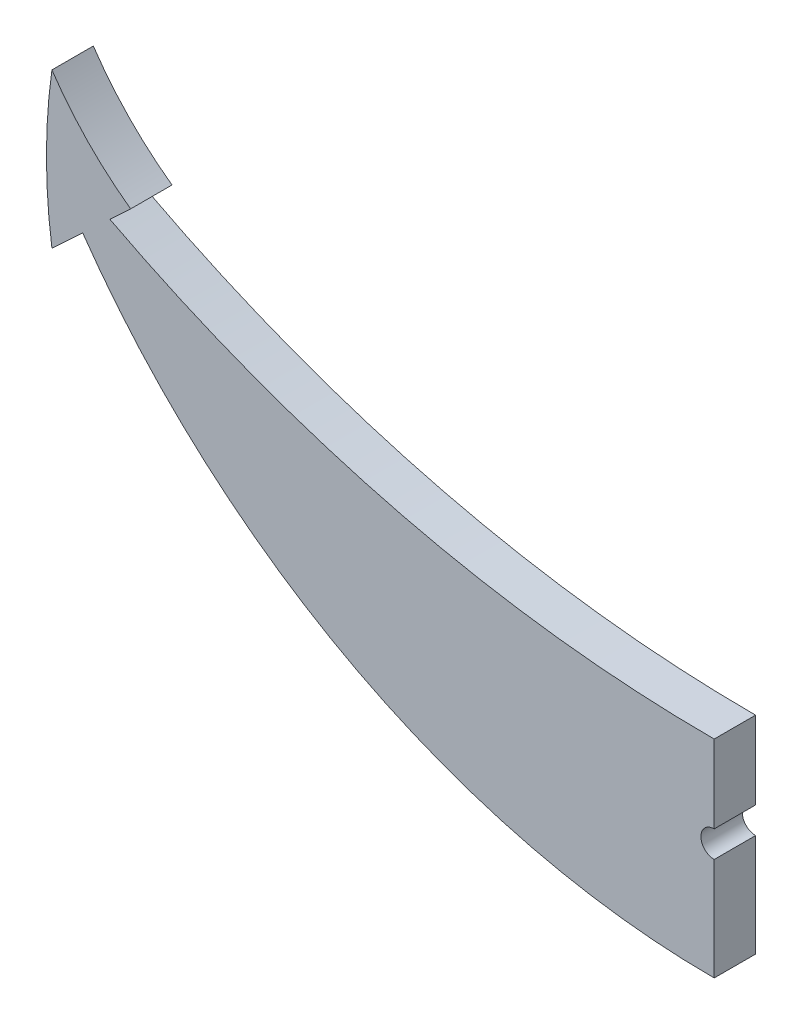
ISO-10303-21;
HEADER;
FILE_DESCRIPTION(('STEP AP214'),'2;1');
FILE_NAME('part.step','',(''),(''),'','','');
FILE_SCHEMA(('AUTOMOTIVE_DESIGN { 1 0 10303 214 1 1 1 1 }'));
ENDSEC;
DATA;
#1=APPLICATION_CONTEXT('core data for automotive mechanical design processes');
#2=APPLICATION_PROTOCOL_DEFINITION('international standard','automotive_design',2000,#1);
#3=PRODUCT_CONTEXT('',#1,'mechanical');
#4=PRODUCT('Part','Part','',(#3));
#5=PRODUCT_RELATED_PRODUCT_CATEGORY('part','',(#4));
#6=PRODUCT_DEFINITION_FORMATION('','',#4);
#7=PRODUCT_DEFINITION_CONTEXT('part definition',#1,'design');
#8=PRODUCT_DEFINITION('design','',#6,#7);
#9=PRODUCT_DEFINITION_SHAPE('','',#8);
#10=(LENGTH_UNIT() NAMED_UNIT(*) SI_UNIT(.MILLI.,.METRE.));
#11=(NAMED_UNIT(*) PLANE_ANGLE_UNIT() SI_UNIT($,.RADIAN.));
#12=(NAMED_UNIT(*) SI_UNIT($,.STERADIAN.) SOLID_ANGLE_UNIT());
#13=UNCERTAINTY_MEASURE_WITH_UNIT(LENGTH_MEASURE(1.E-05),#10,'distance_accuracy_value','');
#14=(GEOMETRIC_REPRESENTATION_CONTEXT(3) GLOBAL_UNCERTAINTY_ASSIGNED_CONTEXT((#13)) GLOBAL_UNIT_ASSIGNED_CONTEXT((#10,
#11,#12)) REPRESENTATION_CONTEXT('',''));
#15=CARTESIAN_POINT('',(0.,0.,0.));
#16=DIRECTION('',(0.,0.,1.));
#17=DIRECTION('',(1.,0.,0.));
#18=AXIS2_PLACEMENT_3D('',#15,#16,#17);
#19=CARTESIAN_POINT('',(0.,158.,5.));
#20=DIRECTION('',(0.,0.,-1.));
#21=DIRECTION('',(-1.,0.,0.));
#22=AXIS2_PLACEMENT_3D('',#19,#20,#21);
#23=CYLINDRICAL_SURFACE('',#22,158.);
#24=CARTESIAN_POINT('',(0.,158.,0.));
#25=DIRECTION('',(0.,0.,-1.));
#26=DIRECTION('',(-1.,0.,0.));
#27=AXIS2_PLACEMENT_3D('',#24,#25,#26);
#28=CIRCLE('',#27,158.);
#29=CARTESIAN_POINT('',(0.,0.,0.));
#30=VERTEX_POINT('',#29);
#31=CARTESIAN_POINT('',(-73.,17.8750557538023,0.));
#32=VERTEX_POINT('',#31);
#33=EDGE_CURVE('E139',#30,#32,#28,.T.);
#34=ORIENTED_EDGE('',*,*,#33,.T.);
#35=DIRECTION('',(0.,0.,-1.));
#36=VECTOR('',#35,1.);
#37=CARTESIAN_POINT('',(-73.,17.8750557538023,5.));
#38=LINE('',#37,#36);
#39=CARTESIAN_POINT('',(-73.,17.8750557538023,5.));
#40=VERTEX_POINT('',#39);
#41=EDGE_CURVE('E11',#40,#32,#38,.T.);
#42=ORIENTED_EDGE('',*,*,#41,.F.);
#43=CARTESIAN_POINT('',(0.,158.,5.));
#44=DIRECTION('',(0.,0.,-1.));
#45=DIRECTION('',(-1.,0.,0.));
#46=AXIS2_PLACEMENT_3D('',#43,#44,#45);
#47=CIRCLE('',#46,158.);
#48=CARTESIAN_POINT('',(0.,0.,5.));
#49=VERTEX_POINT('',#48);
#50=EDGE_CURVE('E155',#49,#40,#47,.T.);
#51=ORIENTED_EDGE('',*,*,#50,.F.);
#52=DIRECTION('',(0.,0.,-1.));
#53=VECTOR('',#52,1.);
#54=CARTESIAN_POINT('',(0.,0.,5.));
#55=LINE('',#54,#53);
#56=EDGE_CURVE('E135',#49,#30,#55,.T.);
#57=ORIENTED_EDGE('',*,*,#56,.T.);
#58=EDGE_LOOP('',(#34,#42,#51,#57));
#59=FACE_BOUND('',#58,.T.);
#60=ADVANCED_FACE('F37',(#59),#23,.F.);
#61=CARTESIAN_POINT('',(-73.,17.8750557538023,5.));
#62=DIRECTION('',(-0.681998360062505,0.731353701619164,0.));
#63=DIRECTION('',(-0.731353701619164,-0.681998360062505,0.));
#64=AXIS2_PLACEMENT_3D('',#61,#62,#63);
#65=PLANE('',#64);
#66=DIRECTION('',(0.731353701619164,0.681998360062505,0.));
#67=VECTOR('',#66,1.);
#68=CARTESIAN_POINT('',(-73.,17.8750557538023,0.));
#69=LINE('',#68,#67);
#70=CARTESIAN_POINT('',(-70.4924018789508,20.2134288316512,0.));
#71=VERTEX_POINT('',#70);
#72=EDGE_CURVE('E142',#32,#71,#69,.T.);
#73=ORIENTED_EDGE('',*,*,#72,.T.);
#74=DIRECTION('',(0.,0.,-1.));
#75=VECTOR('',#74,1.);
#76=CARTESIAN_POINT('',(-70.4924018789508,20.2134288316512,5.));
#77=LINE('',#76,#75);
#78=CARTESIAN_POINT('',(-70.4924018789508,20.2134288316512,5.));
#79=VERTEX_POINT('',#78);
#80=EDGE_CURVE('E45',#79,#71,#77,.T.);
#81=ORIENTED_EDGE('',*,*,#80,.F.);
#82=DIRECTION('',(0.731353701619164,0.681998360062505,0.));
#83=VECTOR('',#82,1.);
#84=CARTESIAN_POINT('',(-73.,17.8750557538023,5.));
#85=LINE('',#84,#83);
#86=EDGE_CURVE('E99',#40,#79,#85,.T.);
#87=ORIENTED_EDGE('',*,*,#86,.F.);
#88=ORIENTED_EDGE('',*,*,#41,.T.);
#89=EDGE_LOOP('',(#73,#81,#87,#88));
#90=FACE_BOUND('',#89,.T.);
#91=ADVANCED_FACE('F198',(#90),#65,.F.);
#92=CARTESIAN_POINT('',(-47.7045380931658,51.8632829242139,5.));
#93=DIRECTION('',(0.,0.,-1.));
#94=DIRECTION('',(-1.,0.,0.));
#95=AXIS2_PLACEMENT_3D('',#92,#93,#94);
#96=CYLINDRICAL_SURFACE('',#95,39.);
#97=CARTESIAN_POINT('',(-47.7045380931658,51.8632829242139,0.));
#98=DIRECTION('',(0.,0.,-1.));
#99=DIRECTION('',(1.,0.,0.));
#100=AXIS2_PLACEMENT_3D('',#97,#98,#99);
#101=CIRCLE('',#100,39.);
#102=CARTESIAN_POINT('',(-80.,30.,0.));
#103=VERTEX_POINT('',#102);
#104=EDGE_CURVE('E144',#71,#103,#101,.T.);
#105=ORIENTED_EDGE('',*,*,#104,.T.);
#106=DIRECTION('',(0.,0.,-1.));
#107=VECTOR('',#106,1.);
#108=CARTESIAN_POINT('',(-80.,30.,5.));
#109=LINE('',#108,#107);
#110=CARTESIAN_POINT('',(-80.,30.,5.));
#111=VERTEX_POINT('',#110);
#112=EDGE_CURVE('E165',#111,#103,#109,.T.);
#113=ORIENTED_EDGE('',*,*,#112,.F.);
#114=CARTESIAN_POINT('',(-47.7045380931658,51.8632829242139,5.));
#115=DIRECTION('',(0.,0.,-1.));
#116=DIRECTION('',(1.,0.,0.));
#117=AXIS2_PLACEMENT_3D('',#114,#115,#116);
#118=CIRCLE('',#117,39.);
#119=EDGE_CURVE('E173',#79,#111,#118,.T.);
#120=ORIENTED_EDGE('',*,*,#119,.F.);
#121=ORIENTED_EDGE('',*,*,#80,.T.);
#122=EDGE_LOOP('',(#105,#113,#120,#121));
#123=FACE_BOUND('',#122,.T.);
#124=ADVANCED_FACE('F171',(#123),#96,.F.);
#125=CARTESIAN_POINT('',(-14.6622574920809,20.6737250754194,5.));
#126=DIRECTION('',(0.,0.,-1.));
#127=DIRECTION('',(-1.,0.,0.));
#128=AXIS2_PLACEMENT_3D('',#125,#126,#127);
#129=CYLINDRICAL_SURFACE('',#128,66.);
#130=CARTESIAN_POINT('',(-14.6622574920809,20.6737250754194,0.));
#131=DIRECTION('',(0.,0.,1.));
#132=DIRECTION('',(1.,0.,0.));
#133=AXIS2_PLACEMENT_3D('',#130,#131,#132);
#134=CIRCLE('',#133,66.);
#135=CARTESIAN_POINT('',(-80.,11.3474501508386,0.));
#136=VERTEX_POINT('',#135);
#137=EDGE_CURVE('E146',#103,#136,#134,.T.);
#138=ORIENTED_EDGE('',*,*,#137,.T.);
#139=DIRECTION('',(0.,0.,-1.));
#140=VECTOR('',#139,1.);
#141=CARTESIAN_POINT('',(-80.,11.3474501508386,5.));
#142=LINE('',#141,#140);
#143=CARTESIAN_POINT('',(-80.,11.3474501508386,5.));
#144=VERTEX_POINT('',#143);
#145=EDGE_CURVE('E162',#144,#136,#142,.T.);
#146=ORIENTED_EDGE('',*,*,#145,.F.);
#147=CARTESIAN_POINT('',(-14.6622574920809,20.6737250754194,5.));
#148=DIRECTION('',(0.,0.,1.));
#149=DIRECTION('',(1.,0.,0.));
#150=AXIS2_PLACEMENT_3D('',#147,#148,#149);
#151=CIRCLE('',#150,66.);
#152=EDGE_CURVE('E189',#111,#144,#151,.T.);
#153=ORIENTED_EDGE('',*,*,#152,.F.);
#154=ORIENTED_EDGE('',*,*,#112,.T.);
#155=EDGE_LOOP('',(#138,#146,#153,#154));
#156=FACE_BOUND('',#155,.T.);
#157=ADVANCED_FACE('F182',(#156),#129,.T.);
#158=CARTESIAN_POINT('',(-80.,11.3474501508386,5.));
#159=DIRECTION('',(-0.681998360062502,0.731353701619167,0.));
#160=DIRECTION('',(-0.731353701619167,-0.681998360062502,0.));
#161=AXIS2_PLACEMENT_3D('',#158,#159,#160);
#162=PLANE('',#161);
#163=DIRECTION('',(0.731353701619167,0.681998360062502,0.));
#164=VECTOR('',#163,1.);
#165=CARTESIAN_POINT('',(-80.,11.3474501508386,0.));
#166=LINE('',#165,#164);
#167=CARTESIAN_POINT('',(-76.2874155418167,14.8094911666547,0.));
#168=VERTEX_POINT('',#167);
#169=EDGE_CURVE('E148',#136,#168,#166,.T.);
#170=ORIENTED_EDGE('',*,*,#169,.T.);
#171=DIRECTION('',(0.,0.,-1.));
#172=VECTOR('',#171,1.);
#173=CARTESIAN_POINT('',(-76.2874155418167,14.8094911666547,5.));
#174=LINE('',#173,#172);
#175=CARTESIAN_POINT('',(-76.2874155418167,14.8094911666547,5.));
#176=VERTEX_POINT('',#175);
#177=EDGE_CURVE('E159',#176,#168,#174,.T.);
#178=ORIENTED_EDGE('',*,*,#177,.F.);
#179=DIRECTION('',(0.731353701619167,0.681998360062502,0.));
#180=VECTOR('',#179,1.);
#181=CARTESIAN_POINT('',(-80.,11.3474501508386,5.));
#182=LINE('',#181,#180);
#183=EDGE_CURVE('E188',#144,#176,#182,.T.);
#184=ORIENTED_EDGE('',*,*,#183,.F.);
#185=ORIENTED_EDGE('',*,*,#145,.T.);
#186=EDGE_LOOP('',(#170,#178,#184,#185));
#187=FACE_BOUND('',#186,.T.);
#188=ADVANCED_FACE('F186',(#187),#162,.F.);
#189=CARTESIAN_POINT('',(0.,68.,5.));
#190=DIRECTION('',(0.,0.,-1.));
#191=DIRECTION('',(-1.,0.,0.));
#192=AXIS2_PLACEMENT_3D('',#189,#190,#191);
#193=CYLINDRICAL_SURFACE('',#192,93.);
#194=CARTESIAN_POINT('',(0.,68.,0.));
#195=DIRECTION('',(0.,0.,1.));
#196=DIRECTION('',(-1.,0.,0.));
#197=AXIS2_PLACEMENT_3D('',#194,#195,#196);
#198=CIRCLE('',#197,93.);
#199=CARTESIAN_POINT('',(0.,-25.,0.));
#200=VERTEX_POINT('',#199);
#201=EDGE_CURVE('E150',#168,#200,#198,.T.);
#202=ORIENTED_EDGE('',*,*,#201,.T.);
#203=DIRECTION('',(0.,0.,-1.));
#204=VECTOR('',#203,1.);
#205=CARTESIAN_POINT('',(0.,-25.,5.));
#206=LINE('',#205,#204);
#207=CARTESIAN_POINT('',(0.,-25.,5.));
#208=VERTEX_POINT('',#207);
#209=EDGE_CURVE('E130',#208,#200,#206,.T.);
#210=ORIENTED_EDGE('',*,*,#209,.F.);
#211=CARTESIAN_POINT('',(0.,68.,5.));
#212=DIRECTION('',(0.,0.,1.));
#213=DIRECTION('',(-1.,0.,0.));
#214=AXIS2_PLACEMENT_3D('',#211,#212,#213);
#215=CIRCLE('',#214,93.);
#216=EDGE_CURVE('E121',#176,#208,#215,.T.);
#217=ORIENTED_EDGE('',*,*,#216,.F.);
#218=ORIENTED_EDGE('',*,*,#177,.T.);
#219=EDGE_LOOP('',(#202,#210,#217,#218));
#220=FACE_BOUND('',#219,.T.);
#221=ADVANCED_FACE('F210',(#220),#193,.T.);
#222=CARTESIAN_POINT('',(0.,-12.6,5.));
#223=DIRECTION('',(-1.,0.,0.));
#224=DIRECTION('',(0.,-1.,0.));
#225=AXIS2_PLACEMENT_3D('',#222,#223,#224);
#226=PLANE('',#225);
#227=DIRECTION('',(0.,1.,0.));
#228=VECTOR('',#227,1.);
#229=CARTESIAN_POINT('',(0.,-12.6,0.));
#230=LINE('',#229,#228);
#231=CARTESIAN_POINT('',(0.,-12.6,0.));
#232=VERTEX_POINT('',#231);
#233=EDGE_CURVE('E129',#200,#232,#230,.T.);
#234=ORIENTED_EDGE('',*,*,#233,.T.);
#235=DIRECTION('',(0.,0.,-1.));
#236=VECTOR('',#235,1.);
#237=CARTESIAN_POINT('',(0.,-12.6,5.));
#238=LINE('',#237,#236);
#239=CARTESIAN_POINT('',(0.,-12.6,5.));
#240=VERTEX_POINT('',#239);
#241=EDGE_CURVE('E126',#240,#232,#238,.T.);
#242=ORIENTED_EDGE('',*,*,#241,.F.);
#243=DIRECTION('',(0.,1.,0.));
#244=VECTOR('',#243,1.);
#245=CARTESIAN_POINT('',(0.,-12.6,5.));
#246=LINE('',#245,#244);
#247=EDGE_CURVE('E115',#208,#240,#246,.T.);
#248=ORIENTED_EDGE('',*,*,#247,.F.);
#249=ORIENTED_EDGE('',*,*,#209,.T.);
#250=EDGE_LOOP('',(#234,#242,#248,#249));
#251=FACE_BOUND('',#250,.T.);
#252=ADVANCED_FACE('F127',(#251),#226,.F.);
#253=CARTESIAN_POINT('',(0.,-11.,5.));
#254=DIRECTION('',(0.,0.,-1.));
#255=DIRECTION('',(-1.,0.,0.));
#256=AXIS2_PLACEMENT_3D('',#253,#254,#255);
#257=CYLINDRICAL_SURFACE('',#256,1.6);
#258=CARTESIAN_POINT('',(0.,-11.,0.));
#259=DIRECTION('',(0.,0.,-1.));
#260=DIRECTION('',(1.,0.,0.));
#261=AXIS2_PLACEMENT_3D('',#258,#259,#260);
#262=CIRCLE('',#261,1.6);
#263=CARTESIAN_POINT('',(0.,-9.4,0.));
#264=VERTEX_POINT('',#263);
#265=EDGE_CURVE('E85',#232,#264,#262,.T.);
#266=ORIENTED_EDGE('',*,*,#265,.T.);
#267=DIRECTION('',(0.,0.,-1.));
#268=VECTOR('',#267,1.);
#269=CARTESIAN_POINT('',(0.,-9.4,5.));
#270=LINE('',#269,#268);
#271=CARTESIAN_POINT('',(0.,-9.4,5.));
#272=VERTEX_POINT('',#271);
#273=EDGE_CURVE('E131',#272,#264,#270,.T.);
#274=ORIENTED_EDGE('',*,*,#273,.F.);
#275=CARTESIAN_POINT('',(0.,-11.,5.));
#276=DIRECTION('',(0.,0.,-1.));
#277=DIRECTION('',(1.,0.,0.));
#278=AXIS2_PLACEMENT_3D('',#275,#276,#277);
#279=CIRCLE('',#278,1.6);
#280=EDGE_CURVE('E119',#240,#272,#279,.T.);
#281=ORIENTED_EDGE('',*,*,#280,.F.);
#282=ORIENTED_EDGE('',*,*,#241,.T.);
#283=EDGE_LOOP('',(#266,#274,#281,#282));
#284=FACE_BOUND('',#283,.T.);
#285=ADVANCED_FACE('F133',(#284),#257,.F.);
#286=CARTESIAN_POINT('',(0.,0.,5.));
#287=DIRECTION('',(-1.,0.,0.));
#288=DIRECTION('',(0.,-1.,0.));
#289=AXIS2_PLACEMENT_3D('',#286,#287,#288);
#290=PLANE('',#289);
#291=DIRECTION('',(0.,1.,0.));
#292=VECTOR('',#291,1.);
#293=CARTESIAN_POINT('',(0.,0.,0.));
#294=LINE('',#293,#292);
#295=EDGE_CURVE('E91',#264,#30,#294,.T.);
#296=ORIENTED_EDGE('',*,*,#295,.T.);
#297=ORIENTED_EDGE('',*,*,#56,.F.);
#298=DIRECTION('',(0.,1.,0.));
#299=VECTOR('',#298,1.);
#300=CARTESIAN_POINT('',(0.,0.,5.));
#301=LINE('',#300,#299);
#302=EDGE_CURVE('E53',#272,#49,#301,.T.);
#303=ORIENTED_EDGE('',*,*,#302,.F.);
#304=ORIENTED_EDGE('',*,*,#273,.T.);
#305=EDGE_LOOP('',(#296,#297,#303,#304));
#306=FACE_BOUND('',#305,.T.);
#307=ADVANCED_FACE('F218',(#306),#290,.F.);
#308=CARTESIAN_POINT('',(0.,158.,5.));
#309=DIRECTION('',(0.,0.,-1.));
#310=DIRECTION('',(-1.,0.,0.));
#311=AXIS2_PLACEMENT_3D('',#308,#309,#310);
#312=PLANE('',#311);
#313=ORIENTED_EDGE('',*,*,#50,.T.);
#314=ORIENTED_EDGE('',*,*,#86,.T.);
#315=ORIENTED_EDGE('',*,*,#119,.T.);
#316=ORIENTED_EDGE('',*,*,#152,.T.);
#317=ORIENTED_EDGE('',*,*,#183,.T.);
#318=ORIENTED_EDGE('',*,*,#216,.T.);
#319=ORIENTED_EDGE('',*,*,#247,.T.);
#320=ORIENTED_EDGE('',*,*,#280,.T.);
#321=ORIENTED_EDGE('',*,*,#302,.T.);
#322=EDGE_LOOP('',(#313,#314,#315,#316,#317,#318,#319,#320,#321));
#323=FACE_BOUND('',#322,.T.);
#324=ADVANCED_FACE('F117',(#323),#312,.F.);
#325=CARTESIAN_POINT('',(0.,158.,0.));
#326=DIRECTION('',(0.,0.,-1.));
#327=DIRECTION('',(-1.,0.,0.));
#328=AXIS2_PLACEMENT_3D('',#325,#326,#327);
#329=PLANE('',#328);
#330=ORIENTED_EDGE('',*,*,#33,.F.);
#331=ORIENTED_EDGE('',*,*,#295,.F.);
#332=ORIENTED_EDGE('',*,*,#265,.F.);
#333=ORIENTED_EDGE('',*,*,#233,.F.);
#334=ORIENTED_EDGE('',*,*,#201,.F.);
#335=ORIENTED_EDGE('',*,*,#169,.F.);
#336=ORIENTED_EDGE('',*,*,#137,.F.);
#337=ORIENTED_EDGE('',*,*,#104,.F.);
#338=ORIENTED_EDGE('',*,*,#72,.F.);
#339=EDGE_LOOP('',(#330,#331,#332,#333,#334,#335,#336,#337,#338));
#340=FACE_BOUND('',#339,.T.);
#341=ADVANCED_FACE('F177',(#340),#329,.T.);
#342=CLOSED_SHELL('',(#60,#91,#124,#157,#188,#221,#252,#285,#307,#324,#341));
#343=MANIFOLD_SOLID_BREP('B2',#342);
#344=ADVANCED_BREP_SHAPE_REPRESENTATION('',(#18,#343),#14);
#345=SHAPE_DEFINITION_REPRESENTATION(#9,#344);
ENDSEC;
END-ISO-10303-21;
